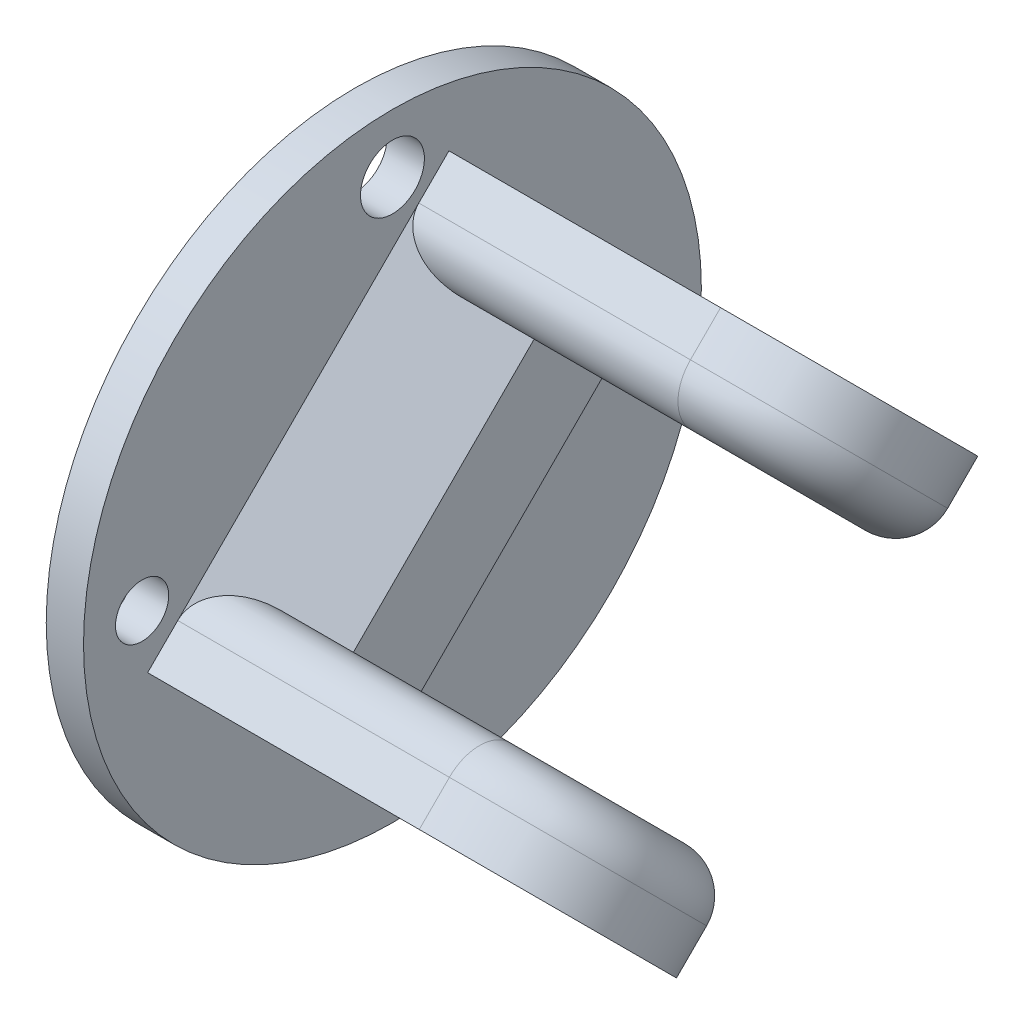
ISO-10303-21;
HEADER;
FILE_DESCRIPTION(('STEP AP214'),'2;1');
FILE_NAME('part.step','',(''),(''),'','','');
FILE_SCHEMA(('AUTOMOTIVE_DESIGN { 1 0 10303 214 1 1 1 1 }'));
ENDSEC;
DATA;
#1=APPLICATION_CONTEXT('core data for automotive mechanical design processes');
#2=APPLICATION_PROTOCOL_DEFINITION('international standard','automotive_design',2000,#1);
#3=PRODUCT_CONTEXT('',#1,'mechanical');
#4=PRODUCT('Part','Part','',(#3));
#5=PRODUCT_RELATED_PRODUCT_CATEGORY('part','',(#4));
#6=PRODUCT_DEFINITION_FORMATION('','',#4);
#7=PRODUCT_DEFINITION_CONTEXT('part definition',#1,'design');
#8=PRODUCT_DEFINITION('design','',#6,#7);
#9=PRODUCT_DEFINITION_SHAPE('','',#8);
#10=(LENGTH_UNIT() NAMED_UNIT(*) SI_UNIT(.MILLI.,.METRE.));
#11=(NAMED_UNIT(*) PLANE_ANGLE_UNIT() SI_UNIT($,.RADIAN.));
#12=(NAMED_UNIT(*) SI_UNIT($,.STERADIAN.) SOLID_ANGLE_UNIT());
#13=UNCERTAINTY_MEASURE_WITH_UNIT(LENGTH_MEASURE(1.E-05),#10,'distance_accuracy_value','');
#14=(GEOMETRIC_REPRESENTATION_CONTEXT(3) GLOBAL_UNCERTAINTY_ASSIGNED_CONTEXT((#13)) GLOBAL_UNIT_ASSIGNED_CONTEXT((#10,
#11,#12)) REPRESENTATION_CONTEXT('',''));
#15=CARTESIAN_POINT('',(0.,0.,0.));
#16=DIRECTION('',(0.,0.,1.));
#17=DIRECTION('',(1.,0.,0.));
#18=AXIS2_PLACEMENT_3D('',#15,#16,#17);
#19=CARTESIAN_POINT('',(41.5,-22.9809703885628,5.30330085889914));
#20=DIRECTION('',(0.,0.707106781186549,0.707106781186546));
#21=DIRECTION('',(0.,-0.707106781186546,0.707106781186549));
#22=AXIS2_PLACEMENT_3D('',#19,#20,#21);
#23=PLANE('',#22);
#24=DIRECTION('',(-1.,0.,0.));
#25=VECTOR('',#24,1.);
#26=CARTESIAN_POINT('',(41.5,2.47487373415288,-20.1525432638166));
#27=LINE('',#26,#25);
#28=CARTESIAN_POINT('',(29.,2.47487373415288,-20.1525432638166));
#29=VERTEX_POINT('',#28);
#30=CARTESIAN_POINT('',(3.5,2.47487373415286,-20.1525432638166));
#31=VERTEX_POINT('',#30);
#32=EDGE_CURVE('E176',#29,#31,#27,.T.);
#33=ORIENTED_EDGE('',*,*,#32,.T.);
#34=DIRECTION('',(0.,0.707106781186546,-0.707106781186549));
#35=VECTOR('',#34,1.);
#36=CARTESIAN_POINT('',(3.5,-22.9809703885628,5.30330085889914));
#37=LINE('',#36,#35);
#38=CARTESIAN_POINT('',(3.5,5.30330085889907,-22.9809703885628));
#39=VERTEX_POINT('',#38);
#40=EDGE_CURVE('E170',#31,#39,#37,.T.);
#41=ORIENTED_EDGE('',*,*,#40,.T.);
#42=DIRECTION('',(-1.,0.,0.));
#43=VECTOR('',#42,1.);
#44=CARTESIAN_POINT('',(41.5,5.30330085889907,-22.9809703885628));
#45=LINE('',#44,#43);
#46=CARTESIAN_POINT('',(29.,5.30330085889907,-22.9809703885628));
#47=VERTEX_POINT('',#46);
#48=EDGE_CURVE('E173',#47,#39,#45,.T.);
#49=ORIENTED_EDGE('',*,*,#48,.F.);
#50=DIRECTION('',(0.,0.707106781186546,-0.707106781186549));
#51=VECTOR('',#50,1.);
#52=CARTESIAN_POINT('',(29.,-22.9809703885628,5.30330085889914));
#53=LINE('',#52,#51);
#54=EDGE_CURVE('E267',#47,#29,#53,.F.);
#55=ORIENTED_EDGE('',*,*,#54,.T.);
#56=EDGE_LOOP('',(#33,#41,#49,#55));
#57=FACE_BOUND('',#56,.T.);
#58=ADVANCED_FACE('F67',(#57),#23,.F.);
#59=CARTESIAN_POINT('',(41.5,22.9809703885628,-5.30330085889914));
#60=DIRECTION('',(0.,-0.707106781186549,-0.707106781186546));
#61=DIRECTION('',(0.,0.707106781186546,-0.707106781186549));
#62=AXIS2_PLACEMENT_3D('',#59,#60,#61);
#63=PLANE('',#62);
#64=DIRECTION('',(-1.,0.,0.));
#65=VECTOR('',#64,1.);
#66=CARTESIAN_POINT('',(41.5,-2.47487373415289,20.1525432638166));
#67=LINE('',#66,#65);
#68=CARTESIAN_POINT('',(29.,-2.47487373415288,20.1525432638166));
#69=VERTEX_POINT('',#68);
#70=CARTESIAN_POINT('',(3.5,-2.47487373415286,20.1525432638166));
#71=VERTEX_POINT('',#70);
#72=EDGE_CURVE('E301',#69,#71,#67,.T.);
#73=ORIENTED_EDGE('',*,*,#72,.T.);
#74=DIRECTION('',(0.,-0.707106781186546,0.707106781186549));
#75=VECTOR('',#74,1.);
#76=CARTESIAN_POINT('',(3.5,22.9809703885628,-5.30330085889914));
#77=LINE('',#76,#75);
#78=CARTESIAN_POINT('',(3.5,-5.30330085889908,22.9809703885628));
#79=VERTEX_POINT('',#78);
#80=EDGE_CURVE('E205',#71,#79,#77,.T.);
#81=ORIENTED_EDGE('',*,*,#80,.T.);
#82=DIRECTION('',(-1.,0.,0.));
#83=VECTOR('',#82,1.);
#84=CARTESIAN_POINT('',(41.5,-5.30330085889908,22.9809703885628));
#85=LINE('',#84,#83);
#86=CARTESIAN_POINT('',(29.,-5.30330085889908,22.9809703885628));
#87=VERTEX_POINT('',#86);
#88=EDGE_CURVE('E216',#87,#79,#85,.T.);
#89=ORIENTED_EDGE('',*,*,#88,.F.);
#90=DIRECTION('',(0.,-0.707106781186546,0.707106781186549));
#91=VECTOR('',#90,1.);
#92=CARTESIAN_POINT('',(29.,22.9809703885628,-5.30330085889914));
#93=LINE('',#92,#91);
#94=EDGE_CURVE('E274',#87,#69,#93,.F.);
#95=ORIENTED_EDGE('',*,*,#94,.T.);
#96=EDGE_LOOP('',(#73,#81,#89,#95));
#97=FACE_BOUND('',#96,.T.);
#98=ADVANCED_FACE('F413',(#97),#63,.F.);
#99=CARTESIAN_POINT('',(29.,0.,0.));
#100=DIRECTION('',(0.,0.707106781186546,-0.707106781186549));
#101=DIRECTION('',(0.,0.707106781186549,0.707106781186546));
#102=AXIS2_PLACEMENT_3D('',#99,#100,#101);
#103=CYLINDRICAL_SURFACE('',#102,12.5);
#104=CARTESIAN_POINT('',(29.,-20.1525432638166,2.47487373415296));
#105=VERTEX_POINT('',#104);
#106=CARTESIAN_POINT('',(29.,-22.9809703885628,5.30330085889914));
#107=VERTEX_POINT('',#106);
#108=EDGE_CURVE('E266',#105,#107,#53,.F.);
#109=ORIENTED_EDGE('',*,*,#108,.F.);
#110=CARTESIAN_POINT('',(29.,-11.3137084989847,11.3137084989848));
#111=DIRECTION('',(0.,-0.707106781186546,0.707106781186549));
#112=DIRECTION('',(0.,-0.707106781186549,-0.707106781186546));
#113=AXIS2_PLACEMENT_3D('',#110,#111,#112);
#114=CIRCLE('',#113,12.5);
#115=EDGE_CURVE('E318',#105,#69,#114,.T.);
#116=ORIENTED_EDGE('',*,*,#115,.T.);
#117=ORIENTED_EDGE('',*,*,#94,.F.);
#118=CARTESIAN_POINT('',(29.,-14.1421356237309,14.142135623731));
#119=DIRECTION('',(0.,0.707106781186547,-0.707106781186548));
#120=DIRECTION('',(0.,0.707106781186548,0.707106781186547));
#121=AXIS2_PLACEMENT_3D('',#118,#119,#120);
#122=CIRCLE('',#121,12.5);
#123=EDGE_CURVE('E270',#107,#87,#122,.F.);
#124=ORIENTED_EDGE('',*,*,#123,.F.);
#125=EDGE_LOOP('',(#109,#116,#117,#124));
#126=FACE_BOUND('',#125,.T.);
#127=ADVANCED_FACE('F411',(#126),#103,.T.);
#128=CARTESIAN_POINT('',(29.,-23.9709198822239,23.970919882224));
#129=DIRECTION('',(0.,0.707106781186546,-0.707106781186549));
#130=DIRECTION('',(0.,0.707106781186549,0.707106781186546));
#131=AXIS2_PLACEMENT_3D('',#128,#129,#130);
#132=CYLINDRICAL_SURFACE('',#131,7.5);
#133=CARTESIAN_POINT('',(29.,8.48528137423855,-8.48528137423861));
#134=DIRECTION('',(0.,0.707106781186546,-0.707106781186549));
#135=DIRECTION('',(0.,0.707106781186549,0.707106781186546));
#136=AXIS2_PLACEMENT_3D('',#133,#134,#135);
#137=CIRCLE('',#136,7.5);
#138=CARTESIAN_POINT('',(29.,13.7885822331377,-3.18198051533951));
#139=VERTEX_POINT('',#138);
#140=EDGE_CURVE('E283',#139,#139,#137,.F.);
#141=ORIENTED_EDGE('',*,*,#140,.T.);
#142=EDGE_LOOP('',(#141));
#143=FACE_BOUND('',#142,.T.);
#144=CARTESIAN_POINT('',(29.,14.1421356237309,-14.142135623731));
#145=DIRECTION('',(0.,0.707106781186546,-0.707106781186549));
#146=DIRECTION('',(0.,0.707106781186549,0.707106781186546));
#147=AXIS2_PLACEMENT_3D('',#144,#145,#146);
#148=CIRCLE('',#147,7.5);
#149=CARTESIAN_POINT('',(29.,19.44543648263,-8.8388347648319));
#150=VERTEX_POINT('',#149);
#151=EDGE_CURVE('E288',#150,#150,#148,.T.);
#152=ORIENTED_EDGE('',*,*,#151,.T.);
#153=EDGE_LOOP('',(#152));
#154=FACE_BOUND('',#153,.T.);
#155=ADVANCED_FACE('F576',(#143,#154),#132,.F.);
#156=CARTESIAN_POINT('',(3.5,0.,-23.5));
#157=DIRECTION('',(-1.,0.,0.));
#158=DIRECTION('',(0.,0.,1.));
#159=AXIS2_PLACEMENT_3D('',#156,#157,#158);
#160=CYLINDRICAL_SURFACE('',#159,3.);
#161=CARTESIAN_POINT('',(3.5,0.,-23.5));
#162=DIRECTION('',(1.,0.,0.));
#163=DIRECTION('',(0.,1.,0.));
#164=AXIS2_PLACEMENT_3D('',#161,#162,#163);
#165=CIRCLE('',#164,3.);
#166=CARTESIAN_POINT('',(3.5,3.,-23.5));
#167=VERTEX_POINT('',#166);
#168=EDGE_CURVE('E238',#167,#167,#165,.T.);
#169=ORIENTED_EDGE('',*,*,#168,.T.);
#170=EDGE_LOOP('',(#169));
#171=FACE_BOUND('',#170,.T.);
#172=CARTESIAN_POINT('',(0.,0.,-23.5));
#173=DIRECTION('',(1.,0.,0.));
#174=DIRECTION('',(0.,1.,0.));
#175=AXIS2_PLACEMENT_3D('',#172,#173,#174);
#176=CIRCLE('',#175,3.);
#177=CARTESIAN_POINT('',(0.,3.,-23.5));
#178=VERTEX_POINT('',#177);
#179=EDGE_CURVE('E257',#178,#178,#176,.T.);
#180=ORIENTED_EDGE('',*,*,#179,.F.);
#181=EDGE_LOOP('',(#180));
#182=FACE_BOUND('',#181,.T.);
#183=ADVANCED_FACE('F572',(#171,#182),#160,.F.);
#184=CARTESIAN_POINT('',(3.5,0.,23.5));
#185=DIRECTION('',(-1.,0.,0.));
#186=DIRECTION('',(0.,0.,1.));
#187=AXIS2_PLACEMENT_3D('',#184,#185,#186);
#188=CYLINDRICAL_SURFACE('',#187,2.5);
#189=CARTESIAN_POINT('',(3.5,0.,23.5));
#190=DIRECTION('',(1.,0.,0.));
#191=DIRECTION('',(0.,1.,0.));
#192=AXIS2_PLACEMENT_3D('',#189,#190,#191);
#193=CIRCLE('',#192,2.5);
#194=CARTESIAN_POINT('',(3.5,2.5,23.5));
#195=VERTEX_POINT('',#194);
#196=EDGE_CURVE('E234',#195,#195,#193,.T.);
#197=ORIENTED_EDGE('',*,*,#196,.T.);
#198=EDGE_LOOP('',(#197));
#199=FACE_BOUND('',#198,.T.);
#200=CARTESIAN_POINT('',(0.,0.,23.5));
#201=DIRECTION('',(1.,0.,0.));
#202=DIRECTION('',(0.,1.,0.));
#203=AXIS2_PLACEMENT_3D('',#200,#201,#202);
#204=CIRCLE('',#203,2.5);
#205=CARTESIAN_POINT('',(0.,2.5,23.5));
#206=VERTEX_POINT('',#205);
#207=EDGE_CURVE('E253',#206,#206,#204,.T.);
#208=ORIENTED_EDGE('',*,*,#207,.F.);
#209=EDGE_LOOP('',(#208));
#210=FACE_BOUND('',#209,.T.);
#211=ADVANCED_FACE('F575',(#199,#210),#188,.F.);
#212=CARTESIAN_POINT('',(3.5,23.5,0.));
#213=DIRECTION('',(-1.,0.,0.));
#214=DIRECTION('',(0.,0.,1.));
#215=AXIS2_PLACEMENT_3D('',#212,#213,#214);
#216=CYLINDRICAL_SURFACE('',#215,3.);
#217=CARTESIAN_POINT('',(3.5,23.5,0.));
#218=DIRECTION('',(1.,0.,0.));
#219=DIRECTION('',(0.,1.,0.));
#220=AXIS2_PLACEMENT_3D('',#217,#218,#219);
#221=CIRCLE('',#220,3.);
#222=CARTESIAN_POINT('',(3.5,26.5,0.));
#223=VERTEX_POINT('',#222);
#224=EDGE_CURVE('E229',#223,#223,#221,.T.);
#225=ORIENTED_EDGE('',*,*,#224,.T.);
#226=EDGE_LOOP('',(#225));
#227=FACE_BOUND('',#226,.T.);
#228=CARTESIAN_POINT('',(0.,23.5,0.));
#229=DIRECTION('',(1.,0.,0.));
#230=DIRECTION('',(0.,1.,0.));
#231=AXIS2_PLACEMENT_3D('',#228,#229,#230);
#232=CIRCLE('',#231,3.);
#233=CARTESIAN_POINT('',(0.,26.5,0.));
#234=VERTEX_POINT('',#233);
#235=EDGE_CURVE('E249',#234,#234,#232,.T.);
#236=ORIENTED_EDGE('',*,*,#235,.F.);
#237=EDGE_LOOP('',(#236));
#238=FACE_BOUND('',#237,.T.);
#239=ADVANCED_FACE('F583',(#227,#238),#216,.F.);
#240=CARTESIAN_POINT('',(3.5,0.,0.));
#241=DIRECTION('',(-1.,0.,0.));
#242=DIRECTION('',(0.,0.,1.));
#243=AXIS2_PLACEMENT_3D('',#240,#241,#242);
#244=CYLINDRICAL_SURFACE('',#243,29.);
#245=CARTESIAN_POINT('',(3.5,0.,0.));
#246=DIRECTION('',(1.,0.,0.));
#247=DIRECTION('',(0.,1.,0.));
#248=AXIS2_PLACEMENT_3D('',#245,#246,#247);
#249=CIRCLE('',#248,29.);
#250=CARTESIAN_POINT('',(3.5,29.,0.));
#251=VERTEX_POINT('',#250);
#252=EDGE_CURVE('E225',#251,#251,#249,.T.);
#253=ORIENTED_EDGE('',*,*,#252,.F.);
#254=EDGE_LOOP('',(#253));
#255=FACE_BOUND('',#254,.T.);
#256=CARTESIAN_POINT('',(0.,0.,0.));
#257=DIRECTION('',(1.,0.,0.));
#258=DIRECTION('',(0.,1.,0.));
#259=AXIS2_PLACEMENT_3D('',#256,#257,#258);
#260=CIRCLE('',#259,29.);
#261=CARTESIAN_POINT('',(0.,29.,0.));
#262=VERTEX_POINT('',#261);
#263=EDGE_CURVE('E221',#262,#262,#260,.T.);
#264=ORIENTED_EDGE('',*,*,#263,.T.);
#265=EDGE_LOOP('',(#264));
#266=FACE_BOUND('',#265,.T.);
#267=ADVANCED_FACE('F586',(#255,#266),#244,.T.);
#268=CARTESIAN_POINT('',(3.5,-23.5,0.));
#269=DIRECTION('',(-1.,0.,0.));
#270=DIRECTION('',(0.,0.,1.));
#271=AXIS2_PLACEMENT_3D('',#268,#269,#270);
#272=CYLINDRICAL_SURFACE('',#271,3.);
#273=CARTESIAN_POINT('',(3.5,-23.5,0.));
#274=DIRECTION('',(1.,0.,0.));
#275=DIRECTION('',(0.,1.,0.));
#276=AXIS2_PLACEMENT_3D('',#273,#274,#275);
#277=CIRCLE('',#276,3.);
#278=CARTESIAN_POINT('',(3.5,-20.5,0.));
#279=VERTEX_POINT('',#278);
#280=EDGE_CURVE('E242',#279,#279,#277,.T.);
#281=ORIENTED_EDGE('',*,*,#280,.T.);
#282=EDGE_LOOP('',(#281));
#283=FACE_BOUND('',#282,.T.);
#284=CARTESIAN_POINT('',(0.,-23.5,0.));
#285=DIRECTION('',(1.,0.,0.));
#286=DIRECTION('',(0.,1.,0.));
#287=AXIS2_PLACEMENT_3D('',#284,#285,#286);
#288=CIRCLE('',#287,3.);
#289=CARTESIAN_POINT('',(0.,-20.5,0.));
#290=VERTEX_POINT('',#289);
#291=EDGE_CURVE('E230',#290,#290,#288,.T.);
#292=ORIENTED_EDGE('',*,*,#291,.F.);
#293=EDGE_LOOP('',(#292));
#294=FACE_BOUND('',#293,.T.);
#295=ADVANCED_FACE('F560',(#283,#294),#272,.F.);
#296=CARTESIAN_POINT('',(3.5,11.75,0.));
#297=DIRECTION('',(1.,0.,0.));
#298=DIRECTION('',(0.,0.,-1.));
#299=AXIS2_PLACEMENT_3D('',#296,#297,#298);
#300=PLANE('',#299);
#301=DIRECTION('',(0.,-0.707106781186548,-0.707106781186547));
#302=VECTOR('',#301,1.);
#303=CARTESIAN_POINT('',(3.5,-5.30330085889908,22.9809703885628));
#304=LINE('',#303,#302);
#305=CARTESIAN_POINT('',(3.5,-22.9809703885628,5.30330085889914));
#306=VERTEX_POINT('',#305);
#307=EDGE_CURVE('E183',#79,#306,#304,.T.);
#308=ORIENTED_EDGE('',*,*,#307,.F.);
#309=ORIENTED_EDGE('',*,*,#80,.F.);
#310=CARTESIAN_POINT('',(3.5,20.1525432638166,-2.47487373415294));
#311=VERTEX_POINT('',#310);
#312=EDGE_CURVE('E210',#311,#71,#77,.T.);
#313=ORIENTED_EDGE('',*,*,#312,.F.);
#314=CARTESIAN_POINT('',(3.5,22.9809703885628,-5.30330085889914));
#315=VERTEX_POINT('',#314);
#316=EDGE_CURVE('E203',#315,#311,#77,.T.);
#317=ORIENTED_EDGE('',*,*,#316,.F.);
#318=DIRECTION('',(0.,0.707106781186548,0.707106781186547));
#319=VECTOR('',#318,1.);
#320=CARTESIAN_POINT('',(3.5,5.30330085889908,-22.9809703885628));
#321=LINE('',#320,#319);
#322=EDGE_CURVE('E190',#39,#315,#321,.T.);
#323=ORIENTED_EDGE('',*,*,#322,.F.);
#324=ORIENTED_EDGE('',*,*,#40,.F.);
#325=CARTESIAN_POINT('',(3.5,-20.1525432638166,2.47487373415294));
#326=VERTEX_POINT('',#325);
#327=EDGE_CURVE('E182',#326,#31,#37,.T.);
#328=ORIENTED_EDGE('',*,*,#327,.F.);
#329=EDGE_CURVE('E185',#306,#326,#37,.T.);
#330=ORIENTED_EDGE('',*,*,#329,.F.);
#331=EDGE_LOOP('',(#308,#309,#313,#317,#323,#324,#328,#330));
#332=FACE_BOUND('',#331,.T.);
#333=ORIENTED_EDGE('',*,*,#252,.T.);
#334=EDGE_LOOP('',(#333));
#335=FACE_BOUND('',#334,.T.);
#336=ORIENTED_EDGE('',*,*,#224,.F.);
#337=EDGE_LOOP('',(#336));
#338=FACE_BOUND('',#337,.T.);
#339=ORIENTED_EDGE('',*,*,#196,.F.);
#340=EDGE_LOOP('',(#339));
#341=FACE_BOUND('',#340,.T.);
#342=ORIENTED_EDGE('',*,*,#168,.F.);
#343=EDGE_LOOP('',(#342));
#344=FACE_BOUND('',#343,.T.);
#345=ORIENTED_EDGE('',*,*,#280,.F.);
#346=EDGE_LOOP('',(#345));
#347=FACE_BOUND('',#346,.T.);
#348=ADVANCED_FACE('F199',(#332,#335,#338,#341,#344,#347),#300,.T.);
#349=CARTESIAN_POINT('',(0.,11.75,0.));
#350=DIRECTION('',(1.,0.,0.));
#351=DIRECTION('',(0.,0.,-1.));
#352=AXIS2_PLACEMENT_3D('',#349,#350,#351);
#353=PLANE('',#352);
#354=ORIENTED_EDGE('',*,*,#263,.F.);
#355=EDGE_LOOP('',(#354));
#356=FACE_BOUND('',#355,.T.);
#357=ORIENTED_EDGE('',*,*,#235,.T.);
#358=EDGE_LOOP('',(#357));
#359=FACE_BOUND('',#358,.T.);
#360=ORIENTED_EDGE('',*,*,#207,.T.);
#361=EDGE_LOOP('',(#360));
#362=FACE_BOUND('',#361,.T.);
#363=ORIENTED_EDGE('',*,*,#179,.T.);
#364=EDGE_LOOP('',(#363));
#365=FACE_BOUND('',#364,.T.);
#366=ORIENTED_EDGE('',*,*,#291,.T.);
#367=EDGE_LOOP('',(#366));
#368=FACE_BOUND('',#367,.T.);
#369=ADVANCED_FACE('F559',(#356,#359,#362,#365,#368),#353,.F.);
#370=CARTESIAN_POINT('',(41.5,-5.30330085889908,22.9809703885628));
#371=DIRECTION('',(0.,0.707106781186547,-0.707106781186548));
#372=DIRECTION('',(0.,0.707106781186548,0.707106781186547));
#373=AXIS2_PLACEMENT_3D('',#370,#371,#372);
#374=PLANE('',#373);
#375=CARTESIAN_POINT('',(29.,-14.1421356237309,14.142135623731));
#376=DIRECTION('',(0.,0.707106781186547,-0.707106781186548));
#377=DIRECTION('',(0.,0.707106781186548,0.707106781186547));
#378=AXIS2_PLACEMENT_3D('',#375,#376,#377);
#379=CIRCLE('',#378,7.5);
#380=CARTESIAN_POINT('',(29.,-8.83883476483183,19.4454364826301));
#381=VERTEX_POINT('',#380);
#382=EDGE_CURVE('E391',#381,#381,#379,.T.);
#383=ORIENTED_EDGE('',*,*,#382,.T.);
#384=EDGE_LOOP('',(#383));
#385=FACE_BOUND('',#384,.T.);
#386=DIRECTION('',(-1.,0.,0.));
#387=VECTOR('',#386,1.);
#388=CARTESIAN_POINT('',(41.5,-22.9809703885628,5.30330085889914));
#389=LINE('',#388,#387);
#390=EDGE_CURVE('E194',#107,#306,#389,.T.);
#391=ORIENTED_EDGE('',*,*,#390,.F.);
#392=ORIENTED_EDGE('',*,*,#123,.T.);
#393=ORIENTED_EDGE('',*,*,#88,.T.);
#394=ORIENTED_EDGE('',*,*,#307,.T.);
#395=EDGE_LOOP('',(#391,#392,#393,#394));
#396=FACE_BOUND('',#395,.T.);
#397=ADVANCED_FACE('F399',(#385,#396),#374,.F.);
#398=ORIENTED_EDGE('',*,*,#329,.T.);
#399=DIRECTION('',(1.,0.,0.));
#400=VECTOR('',#399,1.);
#401=CARTESIAN_POINT('',(41.5,-20.1525432638166,2.47487373415296));
#402=LINE('',#401,#400);
#403=EDGE_CURVE('E278',#326,#105,#402,.T.);
#404=ORIENTED_EDGE('',*,*,#403,.T.);
#405=ORIENTED_EDGE('',*,*,#108,.T.);
#406=ORIENTED_EDGE('',*,*,#390,.T.);
#407=EDGE_LOOP('',(#398,#404,#405,#406));
#408=FACE_BOUND('',#407,.T.);
#409=ADVANCED_FACE('F405',(#408),#23,.F.);
#410=CARTESIAN_POINT('',(41.5,5.30330085889908,-22.9809703885628));
#411=DIRECTION('',(0.,-0.707106781186547,0.707106781186548));
#412=DIRECTION('',(0.,-0.707106781186548,-0.707106781186547));
#413=AXIS2_PLACEMENT_3D('',#410,#411,#412);
#414=PLANE('',#413);
#415=ORIENTED_EDGE('',*,*,#151,.F.);
#416=EDGE_LOOP('',(#415));
#417=FACE_BOUND('',#416,.T.);
#418=CARTESIAN_POINT('',(29.,14.1421356237309,-14.142135623731));
#419=DIRECTION('',(0.,-0.707106781186547,0.707106781186548));
#420=DIRECTION('',(0.,-0.707106781186548,-0.707106781186547));
#421=AXIS2_PLACEMENT_3D('',#418,#419,#420);
#422=CIRCLE('',#421,12.5);
#423=CARTESIAN_POINT('',(29.,22.9809703885628,-5.30330085889914));
#424=VERTEX_POINT('',#423);
#425=EDGE_CURVE('E192',#424,#47,#422,.F.);
#426=ORIENTED_EDGE('',*,*,#425,.T.);
#427=ORIENTED_EDGE('',*,*,#48,.T.);
#428=ORIENTED_EDGE('',*,*,#322,.T.);
#429=DIRECTION('',(-1.,0.,0.));
#430=VECTOR('',#429,1.);
#431=CARTESIAN_POINT('',(41.5,22.9809703885628,-5.30330085889914));
#432=LINE('',#431,#430);
#433=EDGE_CURVE('E195',#424,#315,#432,.T.);
#434=ORIENTED_EDGE('',*,*,#433,.F.);
#435=EDGE_LOOP('',(#426,#427,#428,#434));
#436=FACE_BOUND('',#435,.T.);
#437=ADVANCED_FACE('F188',(#417,#436),#414,.F.);
#438=ORIENTED_EDGE('',*,*,#316,.T.);
#439=DIRECTION('',(1.,0.,0.));
#440=VECTOR('',#439,1.);
#441=CARTESIAN_POINT('',(41.5,20.1525432638166,-2.47487373415296));
#442=LINE('',#441,#440);
#443=CARTESIAN_POINT('',(29.,20.1525432638166,-2.47487373415296));
#444=VERTEX_POINT('',#443);
#445=EDGE_CURVE('E304',#311,#444,#442,.T.);
#446=ORIENTED_EDGE('',*,*,#445,.T.);
#447=EDGE_CURVE('E273',#444,#424,#93,.F.);
#448=ORIENTED_EDGE('',*,*,#447,.T.);
#449=ORIENTED_EDGE('',*,*,#433,.T.);
#450=EDGE_LOOP('',(#438,#446,#448,#449));
#451=FACE_BOUND('',#450,.T.);
#452=ADVANCED_FACE('F436',(#451),#63,.F.);
#453=ORIENTED_EDGE('',*,*,#447,.F.);
#454=CARTESIAN_POINT('',(29.,11.3137084989847,-11.3137084989848));
#455=DIRECTION('',(0.,0.707106781186546,-0.707106781186549));
#456=DIRECTION('',(0.,0.707106781186549,0.707106781186546));
#457=AXIS2_PLACEMENT_3D('',#454,#455,#456);
#458=CIRCLE('',#457,12.5);
#459=EDGE_CURVE('E307',#444,#29,#458,.T.);
#460=ORIENTED_EDGE('',*,*,#459,.T.);
#461=ORIENTED_EDGE('',*,*,#54,.F.);
#462=ORIENTED_EDGE('',*,*,#425,.F.);
#463=EDGE_LOOP('',(#453,#460,#461,#462));
#464=FACE_BOUND('',#463,.T.);
#465=ADVANCED_FACE('F544',(#464),#103,.T.);
#466=CARTESIAN_POINT('',(29.,-8.48528137423857,8.48528137423858));
#467=DIRECTION('',(0.,-0.707106781186546,0.707106781186549));
#468=DIRECTION('',(0.,-0.707106781186549,-0.707106781186546));
#469=AXIS2_PLACEMENT_3D('',#466,#467,#468);
#470=CIRCLE('',#469,7.5);
#471=CARTESIAN_POINT('',(29.,-13.7885822331377,3.18198051533949));
#472=VERTEX_POINT('',#471);
#473=EDGE_CURVE('E279',#472,#472,#470,.F.);
#474=ORIENTED_EDGE('',*,*,#473,.T.);
#475=EDGE_LOOP('',(#474));
#476=FACE_BOUND('',#475,.T.);
#477=ORIENTED_EDGE('',*,*,#382,.F.);
#478=EDGE_LOOP('',(#477));
#479=FACE_BOUND('',#478,.T.);
#480=ADVANCED_FACE('F535',(#476,#479),#132,.F.);
#481=CARTESIAN_POINT('',(11.5,0.,0.));
#482=DIRECTION('',(1.,0.,0.));
#483=DIRECTION('',(0.,0.,-1.));
#484=AXIS2_PLACEMENT_3D('',#481,#482,#483);
#485=PLANE('',#484);
#486=DIRECTION('',(0.,0.707106781186549,0.707106781186546));
#487=VECTOR('',#486,1.);
#488=CARTESIAN_POINT('',(11.5,-1.76776695296641,-18.7383297014435));
#489=LINE('',#488,#487);
#490=CARTESIAN_POINT('',(11.5,11.667261889578,-5.30330085889911));
#491=VERTEX_POINT('',#490);
#492=CARTESIAN_POINT('',(11.5,5.30330085889906,-11.6672618895781));
#493=VERTEX_POINT('',#492);
#494=EDGE_CURVE('E330',#491,#493,#489,.F.);
#495=ORIENTED_EDGE('',*,*,#494,.F.);
#496=DIRECTION('',(0.,-0.707106781186546,0.707106781186549));
#497=VECTOR('',#496,1.);
#498=CARTESIAN_POINT('',(11.5,-8.13172798364525,14.4956890143243));
#499=LINE('',#498,#497);
#500=CARTESIAN_POINT('',(11.5,-5.30330085889906,11.6672618895781));
#501=VERTEX_POINT('',#500);
#502=EDGE_CURVE('E341',#491,#501,#499,.T.);
#503=ORIENTED_EDGE('',*,*,#502,.T.);
#504=DIRECTION('',(0.,-0.707106781186549,-0.707106781186546));
#505=VECTOR('',#504,1.);
#506=CARTESIAN_POINT('',(11.5,2.47487373415295,19.4454364826301));
#507=LINE('',#506,#505);
#508=CARTESIAN_POINT('',(11.5,-11.667261889578,5.30330085889912));
#509=VERTEX_POINT('',#508);
#510=EDGE_CURVE('E284',#509,#501,#507,.F.);
#511=ORIENTED_EDGE('',*,*,#510,.F.);
#512=DIRECTION('',(0.,0.707106781186546,-0.707106781186549));
#513=VECTOR('',#512,1.);
#514=CARTESIAN_POINT('',(11.5,8.13172798364525,-14.4956890143243));
#515=LINE('',#514,#513);
#516=EDGE_CURVE('E321',#509,#493,#515,.T.);
#517=ORIENTED_EDGE('',*,*,#516,.T.);
#518=EDGE_LOOP('',(#495,#503,#511,#517));
#519=FACE_BOUND('',#518,.T.);
#520=ADVANCED_FACE('F379',(#519),#485,.T.);
#521=CARTESIAN_POINT('',(11.5,-1.76776695296641,-18.7383297014435));
#522=DIRECTION('',(0.,0.707106781186546,-0.707106781186549));
#523=DIRECTION('',(0.,0.707106781186549,0.707106781186546));
#524=AXIS2_PLACEMENT_3D('',#521,#522,#523);
#525=PLANE('',#524);
#526=DIRECTION('',(1.,0.,0.));
#527=VECTOR('',#526,1.);
#528=CARTESIAN_POINT('',(11.5,14.4956890143242,-2.47487373415294));
#529=LINE('',#528,#527);
#530=CARTESIAN_POINT('',(29.,14.4956890143242,-2.47487373415295));
#531=VERTEX_POINT('',#530);
#532=CARTESIAN_POINT('',(7.50000000000001,14.4956890143242,-2.47487373415294));
#533=VERTEX_POINT('',#532);
#534=EDGE_CURVE('E296',#531,#533,#529,.F.);
#535=ORIENTED_EDGE('',*,*,#534,.T.);
#536=DIRECTION('',(0.707106781186548,-0.5,-0.499999999999998));
#537=VECTOR('',#536,1.);
#538=CARTESIAN_POINT('',(21.,4.94974746830583,-12.0208152801713));
#539=LINE('',#538,#537);
#540=EDGE_CURVE('E357',#533,#491,#539,.T.);
#541=ORIENTED_EDGE('',*,*,#540,.T.);
#542=ORIENTED_EDGE('',*,*,#494,.T.);
#543=DIRECTION('',(-0.707106781186548,-0.5,-0.499999999999998));
#544=VECTOR('',#543,1.);
#545=CARTESIAN_POINT('',(6.50000000000001,1.76776695296633,-15.2027957955108));
#546=LINE('',#545,#544);
#547=CARTESIAN_POINT('',(7.50000000000003,2.4748737341529,-14.4956890143242));
#548=VERTEX_POINT('',#547);
#549=EDGE_CURVE('E360',#493,#548,#546,.T.);
#550=ORIENTED_EDGE('',*,*,#549,.T.);
#551=DIRECTION('',(-1.,0.,0.));
#552=VECTOR('',#551,1.);
#553=CARTESIAN_POINT('',(11.5,2.4748737341529,-14.4956890143242));
#554=LINE('',#553,#552);
#555=CARTESIAN_POINT('',(29.,2.4748737341529,-14.4956890143242));
#556=VERTEX_POINT('',#555);
#557=EDGE_CURVE('E91',#548,#556,#554,.F.);
#558=ORIENTED_EDGE('',*,*,#557,.T.);
#559=CARTESIAN_POINT('',(29.,8.48528137423856,-8.48528137423859));
#560=DIRECTION('',(0.,0.707106781186546,-0.707106781186549));
#561=DIRECTION('',(0.,0.707106781186549,0.707106781186546));
#562=AXIS2_PLACEMENT_3D('',#559,#560,#561);
#563=CIRCLE('',#562,8.5);
#564=EDGE_CURVE('E293',#556,#531,#563,.F.);
#565=ORIENTED_EDGE('',*,*,#564,.T.);
#566=EDGE_LOOP('',(#535,#541,#542,#550,#558,#565));
#567=FACE_BOUND('',#566,.T.);
#568=ORIENTED_EDGE('',*,*,#140,.F.);
#569=EDGE_LOOP('',(#568));
#570=FACE_BOUND('',#569,.T.);
#571=ADVANCED_FACE('F518',(#567,#570),#525,.F.);
#572=CARTESIAN_POINT('',(11.5,2.47487373415295,19.4454364826301));
#573=DIRECTION('',(0.,-0.707106781186546,0.707106781186549));
#574=DIRECTION('',(0.,-0.707106781186549,-0.707106781186546));
#575=AXIS2_PLACEMENT_3D('',#572,#573,#574);
#576=PLANE('',#575);
#577=DIRECTION('',(1.,0.,0.));
#578=VECTOR('',#577,1.);
#579=CARTESIAN_POINT('',(11.5,-14.4956890143242,2.47487373415295));
#580=LINE('',#579,#578);
#581=CARTESIAN_POINT('',(29.,-14.4956890143242,2.47487373415294));
#582=VERTEX_POINT('',#581);
#583=CARTESIAN_POINT('',(7.50000000000002,-14.4956890143242,2.47487373415295));
#584=VERTEX_POINT('',#583);
#585=EDGE_CURVE('E83',#582,#584,#580,.F.);
#586=ORIENTED_EDGE('',*,*,#585,.T.);
#587=DIRECTION('',(0.707106781186548,0.5,0.499999999999998));
#588=VECTOR('',#587,1.);
#589=CARTESIAN_POINT('',(21.5,-4.59619407771256,12.3743686707646));
#590=LINE('',#589,#588);
#591=EDGE_CURVE('E11',#584,#509,#590,.T.);
#592=ORIENTED_EDGE('',*,*,#591,.T.);
#593=ORIENTED_EDGE('',*,*,#510,.T.);
#594=DIRECTION('',(-0.707106781186548,0.5,0.499999999999998));
#595=VECTOR('',#594,1.);
#596=CARTESIAN_POINT('',(6.00000000000001,-1.41421356237306,15.556349186104));
#597=LINE('',#596,#595);
#598=CARTESIAN_POINT('',(7.50000000000003,-2.47487373415289,14.4956890143242));
#599=VERTEX_POINT('',#598);
#600=EDGE_CURVE('E345',#501,#599,#597,.T.);
#601=ORIENTED_EDGE('',*,*,#600,.T.);
#602=DIRECTION('',(-1.,0.,0.));
#603=VECTOR('',#602,1.);
#604=CARTESIAN_POINT('',(11.5,-2.47487373415289,14.4956890143242));
#605=LINE('',#604,#603);
#606=CARTESIAN_POINT('',(29.,-2.4748737341529,14.4956890143242));
#607=VERTEX_POINT('',#606);
#608=EDGE_CURVE('E315',#599,#607,#605,.F.);
#609=ORIENTED_EDGE('',*,*,#608,.T.);
#610=CARTESIAN_POINT('',(29.,-8.48528137423856,8.48528137423859));
#611=DIRECTION('',(0.,-0.707106781186546,0.707106781186549));
#612=DIRECTION('',(0.,-0.707106781186549,-0.707106781186546));
#613=AXIS2_PLACEMENT_3D('',#610,#611,#612);
#614=CIRCLE('',#613,8.5);
#615=EDGE_CURVE('E310',#607,#582,#614,.F.);
#616=ORIENTED_EDGE('',*,*,#615,.T.);
#617=EDGE_LOOP('',(#586,#592,#593,#601,#609,#616));
#618=FACE_BOUND('',#617,.T.);
#619=ORIENTED_EDGE('',*,*,#473,.F.);
#620=EDGE_LOOP('',(#619));
#621=FACE_BOUND('',#620,.T.);
#622=ADVANCED_FACE('F375',(#618,#621),#576,.F.);
#623=CARTESIAN_POINT('',(41.5,17.3241161390704,-5.30330085889914));
#624=DIRECTION('',(1.,0.,0.));
#625=DIRECTION('',(0.,0.,-1.));
#626=AXIS2_PLACEMENT_3D('',#623,#624,#625);
#627=CYLINDRICAL_SURFACE('',#626,4.);
#628=ORIENTED_EDGE('',*,*,#445,.F.);
#629=CARTESIAN_POINT('',(7.50000000000001,17.3241161390704,-5.30330085889914));
#630=DIRECTION('',(0.707106781186547,0.500000000000002,0.5));
#631=DIRECTION('',(0.707106781186548,-0.5,-0.499999999999998));
#632=AXIS2_PLACEMENT_3D('',#629,#630,#631);
#633=ELLIPSE('',#632,5.65685424949239,4.);
#634=EDGE_CURVE('E353',#311,#533,#633,.T.);
#635=ORIENTED_EDGE('',*,*,#634,.T.);
#636=ORIENTED_EDGE('',*,*,#534,.F.);
#637=CARTESIAN_POINT('',(29.,17.3241161390704,-5.30330085889915));
#638=DIRECTION('',(1.,0.,0.));
#639=DIRECTION('',(0.,0.,-1.));
#640=AXIS2_PLACEMENT_3D('',#637,#638,#639);
#641=CIRCLE('',#640,4.);
#642=EDGE_CURVE('E325',#444,#531,#641,.T.);
#643=ORIENTED_EDGE('',*,*,#642,.F.);
#644=EDGE_LOOP('',(#628,#635,#636,#643));
#645=FACE_BOUND('',#644,.T.);
#646=ADVANCED_FACE('F508',(#645),#627,.T.);
#647=CARTESIAN_POINT('',(29.,11.3137084989847,-11.3137084989848));
#648=DIRECTION('',(0.,0.707106781186546,-0.707106781186549));
#649=DIRECTION('',(0.,0.707106781186549,0.707106781186546));
#650=AXIS2_PLACEMENT_3D('',#647,#648,#649);
#651=TOROIDAL_SURFACE('',#650,8.5,4.);
#652=ORIENTED_EDGE('',*,*,#642,.T.);
#653=ORIENTED_EDGE('',*,*,#564,.F.);
#654=CARTESIAN_POINT('',(29.,5.30330085889908,-17.3241161390705));
#655=DIRECTION('',(-1.,0.,0.));
#656=DIRECTION('',(0.,0.,1.));
#657=AXIS2_PLACEMENT_3D('',#654,#655,#656);
#658=CIRCLE('',#657,4.);
#659=EDGE_CURVE('E322',#29,#556,#658,.T.);
#660=ORIENTED_EDGE('',*,*,#659,.F.);
#661=ORIENTED_EDGE('',*,*,#459,.F.);
#662=EDGE_LOOP('',(#652,#653,#660,#661));
#663=FACE_BOUND('',#662,.T.);
#664=ADVANCED_FACE('F501',(#663),#651,.T.);
#665=CARTESIAN_POINT('',(41.5,5.30330085889908,-17.3241161390705));
#666=DIRECTION('',(-1.,0.,0.));
#667=DIRECTION('',(0.,0.,1.));
#668=AXIS2_PLACEMENT_3D('',#665,#666,#667);
#669=CYLINDRICAL_SURFACE('',#668,4.);
#670=ORIENTED_EDGE('',*,*,#659,.T.);
#671=ORIENTED_EDGE('',*,*,#557,.F.);
#672=CARTESIAN_POINT('',(7.50000000000001,5.30330085889908,-17.3241161390705));
#673=DIRECTION('',(0.707106781186547,-0.500000000000002,-0.5));
#674=DIRECTION('',(-0.707106781186548,-0.5,-0.499999999999998));
#675=AXIS2_PLACEMENT_3D('',#672,#673,#674);
#676=ELLIPSE('',#675,5.65685424949239,4.);
#677=EDGE_CURVE('E363',#548,#31,#676,.T.);
#678=ORIENTED_EDGE('',*,*,#677,.T.);
#679=ORIENTED_EDGE('',*,*,#32,.F.);
#680=EDGE_LOOP('',(#670,#671,#678,#679));
#681=FACE_BOUND('',#680,.T.);
#682=ADVANCED_FACE('F492',(#681),#669,.T.);
#683=CARTESIAN_POINT('',(41.5,-17.3241161390704,5.30330085889914));
#684=DIRECTION('',(1.,0.,0.));
#685=DIRECTION('',(0.,0.,-1.));
#686=AXIS2_PLACEMENT_3D('',#683,#684,#685);
#687=CYLINDRICAL_SURFACE('',#686,4.);
#688=ORIENTED_EDGE('',*,*,#403,.F.);
#689=CARTESIAN_POINT('',(7.50000000000001,-17.3241161390704,5.30330085889914));
#690=DIRECTION('',(0.707106781186547,-0.500000000000002,-0.5));
#691=DIRECTION('',(0.707106781186548,0.5,0.499999999999998));
#692=AXIS2_PLACEMENT_3D('',#689,#690,#691);
#693=ELLIPSE('',#692,5.65685424949239,4.);
#694=EDGE_CURVE('E77',#326,#584,#693,.T.);
#695=ORIENTED_EDGE('',*,*,#694,.T.);
#696=ORIENTED_EDGE('',*,*,#585,.F.);
#697=CARTESIAN_POINT('',(29.,-17.3241161390704,5.30330085889914));
#698=DIRECTION('',(1.,0.,0.));
#699=DIRECTION('',(0.,0.,-1.));
#700=AXIS2_PLACEMENT_3D('',#697,#698,#699);
#701=CIRCLE('',#700,4.);
#702=EDGE_CURVE('E326',#105,#582,#701,.T.);
#703=ORIENTED_EDGE('',*,*,#702,.F.);
#704=EDGE_LOOP('',(#688,#695,#696,#703));
#705=FACE_BOUND('',#704,.T.);
#706=ADVANCED_FACE('F369',(#705),#687,.T.);
#707=CARTESIAN_POINT('',(29.,-11.3137084989847,11.3137084989848));
#708=DIRECTION('',(0.,-0.707106781186546,0.707106781186549));
#709=DIRECTION('',(0.,-0.707106781186549,-0.707106781186546));
#710=AXIS2_PLACEMENT_3D('',#707,#708,#709);
#711=TOROIDAL_SURFACE('',#710,8.5,4.);
#712=ORIENTED_EDGE('',*,*,#702,.T.);
#713=ORIENTED_EDGE('',*,*,#615,.F.);
#714=CARTESIAN_POINT('',(29.,-5.30330085889908,17.3241161390704));
#715=DIRECTION('',(-1.,0.,0.));
#716=DIRECTION('',(0.,0.,1.));
#717=AXIS2_PLACEMENT_3D('',#714,#715,#716);
#718=CIRCLE('',#717,4.);
#719=EDGE_CURVE('E331',#69,#607,#718,.T.);
#720=ORIENTED_EDGE('',*,*,#719,.F.);
#721=ORIENTED_EDGE('',*,*,#115,.F.);
#722=EDGE_LOOP('',(#712,#713,#720,#721));
#723=FACE_BOUND('',#722,.T.);
#724=ADVANCED_FACE('F482',(#723),#711,.T.);
#725=CARTESIAN_POINT('',(41.5,-5.30330085889908,17.3241161390705));
#726=DIRECTION('',(-1.,0.,0.));
#727=DIRECTION('',(0.,0.,1.));
#728=AXIS2_PLACEMENT_3D('',#725,#726,#727);
#729=CYLINDRICAL_SURFACE('',#728,4.);
#730=ORIENTED_EDGE('',*,*,#719,.T.);
#731=ORIENTED_EDGE('',*,*,#608,.F.);
#732=CARTESIAN_POINT('',(7.50000000000001,-5.30330085889908,17.3241161390705));
#733=DIRECTION('',(0.707106781186547,0.500000000000002,0.5));
#734=DIRECTION('',(-0.707106781186548,0.5,0.499999999999998));
#735=AXIS2_PLACEMENT_3D('',#732,#733,#734);
#736=ELLIPSE('',#735,5.65685424949239,4.);
#737=EDGE_CURVE('E349',#599,#71,#736,.T.);
#738=ORIENTED_EDGE('',*,*,#737,.T.);
#739=ORIENTED_EDGE('',*,*,#72,.F.);
#740=EDGE_LOOP('',(#730,#731,#738,#739));
#741=FACE_BOUND('',#740,.T.);
#742=ADVANCED_FACE('F418',(#741),#729,.T.);
#743=CARTESIAN_POINT('',(11.5,3.18198051533949,3.18198051533947));
#744=DIRECTION('',(0.707106781186547,0.500000000000002,0.5));
#745=DIRECTION('',(0.,0.707106781186546,-0.707106781186549));
#746=AXIS2_PLACEMENT_3D('',#743,#744,#745);
#747=PLANE('',#746);
#748=ORIENTED_EDGE('',*,*,#634,.F.);
#749=ORIENTED_EDGE('',*,*,#312,.T.);
#750=ORIENTED_EDGE('',*,*,#737,.F.);
#751=ORIENTED_EDGE('',*,*,#600,.F.);
#752=ORIENTED_EDGE('',*,*,#502,.F.);
#753=ORIENTED_EDGE('',*,*,#540,.F.);
#754=EDGE_LOOP('',(#748,#749,#750,#751,#752,#753));
#755=FACE_BOUND('',#754,.T.);
#756=ADVANCED_FACE('F421',(#755),#747,.T.);
#757=CARTESIAN_POINT('',(11.5,-3.18198051533949,-3.18198051533947));
#758=DIRECTION('',(0.707106781186547,-0.500000000000002,-0.5));
#759=DIRECTION('',(0.,-0.707106781186546,0.707106781186549));
#760=AXIS2_PLACEMENT_3D('',#757,#758,#759);
#761=PLANE('',#760);
#762=ORIENTED_EDGE('',*,*,#694,.F.);
#763=ORIENTED_EDGE('',*,*,#327,.T.);
#764=ORIENTED_EDGE('',*,*,#677,.F.);
#765=ORIENTED_EDGE('',*,*,#549,.F.);
#766=ORIENTED_EDGE('',*,*,#516,.F.);
#767=ORIENTED_EDGE('',*,*,#591,.F.);
#768=EDGE_LOOP('',(#762,#763,#764,#765,#766,#767));
#769=FACE_BOUND('',#768,.T.);
#770=ADVANCED_FACE('F70',(#769),#761,.T.);
#771=CLOSED_SHELL('',(#58,#98,#127,#155,#183,#211,#239,#267,#295,#348,#369,#397,#409,#437,#452,
#465,#480,#520,#571,#622,#646,#664,#682,#706,#724,#742,#756,#770));
#772=MANIFOLD_SOLID_BREP('B2',#771);
#773=ADVANCED_BREP_SHAPE_REPRESENTATION('',(#18,#772),#14);
#774=SHAPE_DEFINITION_REPRESENTATION(#9,#773);
ENDSEC;
END-ISO-10303-21;
